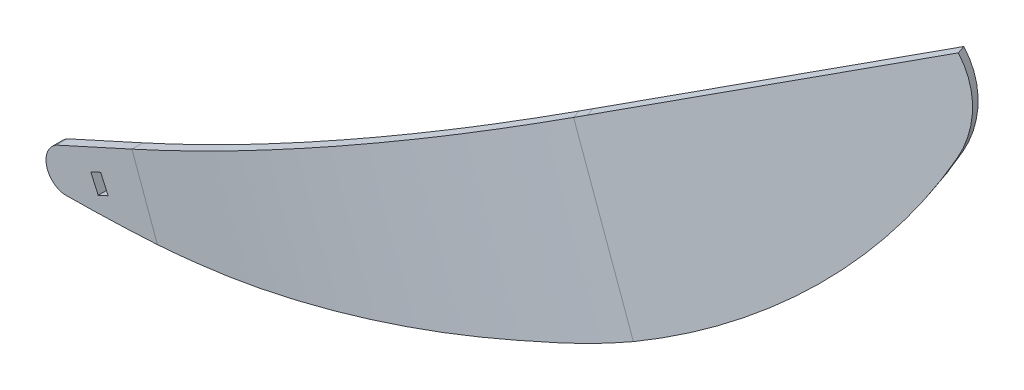
ISO-10303-21;
HEADER;
FILE_DESCRIPTION(('STEP AP214'),'2;1');
FILE_NAME('part.step','',(''),(''),'','','');
FILE_SCHEMA(('AUTOMOTIVE_DESIGN { 1 0 10303 214 1 1 1 1 }'));
ENDSEC;
DATA;
#1=APPLICATION_CONTEXT('core data for automotive mechanical design processes');
#2=APPLICATION_PROTOCOL_DEFINITION('international standard','automotive_design',2000,#1);
#3=PRODUCT_CONTEXT('',#1,'mechanical');
#4=PRODUCT('Part','Part','',(#3));
#5=PRODUCT_RELATED_PRODUCT_CATEGORY('part','',(#4));
#6=PRODUCT_DEFINITION_FORMATION('','',#4);
#7=PRODUCT_DEFINITION_CONTEXT('part definition',#1,'design');
#8=PRODUCT_DEFINITION('design','',#6,#7);
#9=PRODUCT_DEFINITION_SHAPE('','',#8);
#10=(LENGTH_UNIT() NAMED_UNIT(*) SI_UNIT(.MILLI.,.METRE.));
#11=(NAMED_UNIT(*) PLANE_ANGLE_UNIT() SI_UNIT($,.RADIAN.));
#12=(NAMED_UNIT(*) SI_UNIT($,.STERADIAN.) SOLID_ANGLE_UNIT());
#13=UNCERTAINTY_MEASURE_WITH_UNIT(LENGTH_MEASURE(1.E-05),#10,'distance_accuracy_value','');
#14=(GEOMETRIC_REPRESENTATION_CONTEXT(3) GLOBAL_UNCERTAINTY_ASSIGNED_CONTEXT((#13)) GLOBAL_UNIT_ASSIGNED_CONTEXT((#10,
#11,#12)) REPRESENTATION_CONTEXT('',''));
#15=CARTESIAN_POINT('',(0.,0.,0.));
#16=DIRECTION('',(0.,0.,1.));
#17=DIRECTION('',(1.,0.,0.));
#18=AXIS2_PLACEMENT_3D('',#15,#16,#17);
#19=CARTESIAN_POINT('',(83.014106092908,142.239745588982,-13.0819028788313));
#20=DIRECTION('',(0.397093410751114,0.144647911477414,0.906307787036649));
#21=DIRECTION('',(0.917283463911632,-0.0301308807093948,-0.397093410751114));
#22=AXIS2_PLACEMENT_3D('',#19,#20,#21);
#23=CYLINDRICAL_SURFACE('',#22,58.3606331759639);
#24=CARTESIAN_POINT('',(83.6192764508927,142.460189006073,-11.7006898113874));
#25=DIRECTION('',(0.397093410751114,0.144647911477414,0.90630778703665));
#26=DIRECTION('',(0.917283463911632,-0.0301308807093948,-0.397093410751114));
#27=AXIS2_PLACEMENT_3D('',#24,#25,#26);
#28=CIRCLE('',#27,58.3606331759639);
#29=CARTESIAN_POINT('',(104.279360920723,87.8798983524995,-12.0416979789016));
#30=VERTEX_POINT('',#29);
#31=CARTESIAN_POINT('',(132.600445425095,115.799936331135,-28.9064887736133));
#32=VERTEX_POINT('',#31);
#33=EDGE_CURVE('E375',#30,#32,#28,.T.);
#34=ORIENTED_EDGE('',*,*,#33,.F.);
#35=CARTESIAN_POINT('',(103.674190562738,87.6594549354079,-13.4229110463455));
#36=CARTESIAN_POINT('',(104.279360920723,87.8798983524994,-12.0416979789016));
#37=B_SPLINE_CURVE_WITH_KNOTS('',1,(#35,#36),.UNSPECIFIED.,.F.,.F.,(2,2),(0.,1.),.UNSPECIFIED.);
#38=CARTESIAN_POINT('',(103.674190562738,87.6594549354078,-13.4229110463455));
#39=VERTEX_POINT('',#38);
#40=EDGE_CURVE('E324',#30,#39,#37,.F.);
#41=ORIENTED_EDGE('',*,*,#40,.T.);
#42=CARTESIAN_POINT('',(83.014106092908,142.239745588982,-13.0819028788313));
#43=DIRECTION('',(0.397093410751114,0.144647911477414,0.90630778703665));
#44=DIRECTION('',(0.917283463911632,-0.0301308807093948,-0.397093410751114));
#45=AXIS2_PLACEMENT_3D('',#42,#43,#44);
#46=CIRCLE('',#45,58.3606331759639);
#47=CARTESIAN_POINT('',(131.99527506711,115.579492914043,-30.2877018410572));
#48=VERTEX_POINT('',#47);
#49=EDGE_CURVE('E444',#39,#48,#46,.T.);
#50=ORIENTED_EDGE('',*,*,#49,.T.);
#51=DIRECTION('',(0.397093410751114,0.144647911477414,0.906307787036649));
#52=VECTOR('',#51,1.);
#53=CARTESIAN_POINT('',(131.99527506711,115.579492914043,-30.2877018410572));
#54=LINE('',#53,#52);
#55=EDGE_CURVE('E460',#48,#32,#54,.T.);
#56=ORIENTED_EDGE('',*,*,#55,.T.);
#57=EDGE_LOOP('',(#34,#41,#50,#56));
#58=FACE_BOUND('',#57,.T.);
#59=ADVANCED_FACE('F58',(#58),#23,.T.);
#60=CARTESIAN_POINT('',(96.5992940794356,111.170574986929,-14.0754924818592));
#61=DIRECTION('',(-0.40636219666363,0.913140755774543,0.0323067371643325));
#62=DIRECTION('',(-0.822913475561529,-0.381118015644391,0.421381620257132));
#63=AXIS2_PLACEMENT_3D('',#60,#61,#62);
#64=PLANE('',#63);
#65=DIRECTION('',(-0.822913475561529,-0.381118015644391,0.421381620257132));
#66=VECTOR('',#65,1.);
#67=CARTESIAN_POINT('',(96.5992940794356,111.170574986929,-14.0754924818592));
#68=LINE('',#67,#66);
#69=CARTESIAN_POINT('',(96.5992940794356,111.170574986929,-14.0754924818592));
#70=VERTEX_POINT('',#69);
#71=CARTESIAN_POINT('',(95.3248719609345,110.580348622529,-13.4229110463455));
#72=VERTEX_POINT('',#71);
#73=EDGE_CURVE('E447',#70,#72,#68,.T.);
#74=ORIENTED_EDGE('',*,*,#73,.T.);
#75=CARTESIAN_POINT('',(95.9300423189192,110.80079203962,-12.0416979789016));
#76=CARTESIAN_POINT('',(95.3248719609345,110.580348622529,-13.4229110463455));
#77=B_SPLINE_CURVE_WITH_KNOTS('',1,(#75,#76),.UNSPECIFIED.,.F.,.F.,(2,2),(0.,1.),.UNSPECIFIED.);
#78=CARTESIAN_POINT('',(95.9300423189192,110.800792039621,-12.0416979789017));
#79=VERTEX_POINT('',#78);
#80=EDGE_CURVE('E12',#72,#79,#77,.F.);
#81=ORIENTED_EDGE('',*,*,#80,.T.);
#82=DIRECTION('',(-0.822913475561529,-0.381118015644391,0.421381620257132));
#83=VECTOR('',#82,1.);
#84=CARTESIAN_POINT('',(97.2044644374203,111.391018404021,-12.6942794144154));
#85=LINE('',#84,#83);
#86=CARTESIAN_POINT('',(97.2044644374203,111.391018404021,-12.6942794144154));
#87=VERTEX_POINT('',#86);
#88=EDGE_CURVE('E454',#87,#79,#85,.T.);
#89=ORIENTED_EDGE('',*,*,#88,.F.);
#90=DIRECTION('',(0.397093410751114,0.144647911477414,0.906307787036649));
#91=VECTOR('',#90,1.);
#92=CARTESIAN_POINT('',(96.5992940794356,111.170574986929,-14.0754924818592));
#93=LINE('',#92,#91);
#94=EDGE_CURVE('E455',#70,#87,#93,.T.);
#95=ORIENTED_EDGE('',*,*,#94,.F.);
#96=EDGE_LOOP('',(#74,#81,#89,#95));
#97=FACE_BOUND('',#96,.T.);
#98=ADVANCED_FACE('F60',(#97),#64,.T.);
#99=CARTESIAN_POINT('',(32.7005911916889,324.934882128188,-18.5141685714529));
#100=DIRECTION('',(0.397093410751114,0.144647911477414,0.90630778703665));
#101=DIRECTION('',(0.917283463911632,-0.0301308807093948,-0.397093410751114));
#102=AXIS2_PLACEMENT_3D('',#99,#100,#101);
#103=PLANE('',#102);
#104=ORIENTED_EDGE('',*,*,#88,.T.);
#105=DIRECTION('',(0.342266117137559,-0.93960305717871,0.));
#106=VECTOR('',#105,1.);
#107=CARTESIAN_POINT('',(19.6586583606416,320.184140125012,-12.0416979789016));
#108=LINE('',#107,#106);
#109=EDGE_CURVE('E70',#79,#30,#108,.T.);
#110=ORIENTED_EDGE('',*,*,#109,.T.);
#111=ORIENTED_EDGE('',*,*,#33,.T.);
#112=CARTESIAN_POINT('',(122.932266417406,121.062287162069,-25.5103112666063));
#113=DIRECTION('',(0.397093410751114,0.144647911477414,0.90630778703665));
#114=DIRECTION('',(0.917283463911632,-0.0301308807093948,-0.397093410751114));
#115=AXIS2_PLACEMENT_3D('',#112,#113,#114);
#116=CIRCLE('',#115,11.5195504795819);
#117=CARTESIAN_POINT('',(131.427037788079,127.255165100489,-30.2206366748398));
#118=VERTEX_POINT('',#117);
#119=EDGE_CURVE('E448',#32,#118,#116,.T.);
#120=ORIENTED_EDGE('',*,*,#119,.T.);
#121=DIRECTION('',(-0.822784282779922,-0.381408213456814,0.421371331153426));
#122=VECTOR('',#121,1.);
#123=CARTESIAN_POINT('',(131.427037788079,127.255165100489,-30.2206366748398));
#124=LINE('',#123,#122);
#125=EDGE_CURVE('E451',#118,#87,#124,.T.);
#126=ORIENTED_EDGE('',*,*,#125,.T.);
#127=EDGE_LOOP('',(#104,#110,#111,#120,#126));
#128=FACE_BOUND('',#127,.T.);
#129=ADVANCED_FACE('F579',(#128),#103,.T.);
#130=CARTESIAN_POINT('',(130.821867430095,127.034721683398,-31.6018497422836));
#131=DIRECTION('',(-0.406623716903448,0.91301958161526,0.0324406602694974));
#132=DIRECTION('',(-0.822784282779922,-0.381408213456814,0.421371331153426));
#133=AXIS2_PLACEMENT_3D('',#130,#131,#132);
#134=PLANE('',#133);
#135=ORIENTED_EDGE('',*,*,#125,.F.);
#136=DIRECTION('',(0.397093410751114,0.144647911477414,0.906307787036649));
#137=VECTOR('',#136,1.);
#138=CARTESIAN_POINT('',(130.821867430095,127.034721683398,-31.6018497422836));
#139=LINE('',#138,#137);
#140=CARTESIAN_POINT('',(130.821867430095,127.034721683398,-31.6018497422836));
#141=VERTEX_POINT('',#140);
#142=EDGE_CURVE('E458',#141,#118,#139,.T.);
#143=ORIENTED_EDGE('',*,*,#142,.F.);
#144=DIRECTION('',(-0.822784282779922,-0.381408213456814,0.421371331153426));
#145=VECTOR('',#144,1.);
#146=CARTESIAN_POINT('',(130.821867430095,127.034721683398,-31.6018497422836));
#147=LINE('',#146,#145);
#148=EDGE_CURVE('E443',#141,#70,#147,.T.);
#149=ORIENTED_EDGE('',*,*,#148,.T.);
#150=ORIENTED_EDGE('',*,*,#94,.T.);
#151=EDGE_LOOP('',(#135,#143,#149,#150));
#152=FACE_BOUND('',#151,.T.);
#153=ADVANCED_FACE('F424',(#152),#134,.T.);
#154=CARTESIAN_POINT('',(122.327096059422,120.841843744977,-26.8915243340501));
#155=DIRECTION('',(0.397093410751114,0.144647911477414,0.906307787036649));
#156=DIRECTION('',(0.917283463911632,-0.0301308807093948,-0.397093410751114));
#157=AXIS2_PLACEMENT_3D('',#154,#155,#156);
#158=CYLINDRICAL_SURFACE('',#157,11.5195504795819);
#159=ORIENTED_EDGE('',*,*,#119,.F.);
#160=ORIENTED_EDGE('',*,*,#55,.F.);
#161=CARTESIAN_POINT('',(122.327096059422,120.841843744977,-26.8915243340501));
#162=DIRECTION('',(0.397093410751114,0.144647911477414,0.90630778703665));
#163=DIRECTION('',(0.917283463911632,-0.0301308807093948,-0.397093410751114));
#164=AXIS2_PLACEMENT_3D('',#161,#162,#163);
#165=CIRCLE('',#164,11.5195504795819);
#166=EDGE_CURVE('E440',#48,#141,#165,.T.);
#167=ORIENTED_EDGE('',*,*,#166,.T.);
#168=ORIENTED_EDGE('',*,*,#142,.T.);
#169=EDGE_LOOP('',(#159,#160,#167,#168));
#170=FACE_BOUND('',#169,.T.);
#171=ADVANCED_FACE('F573',(#170),#158,.T.);
#172=CARTESIAN_POINT('',(32.0954208337042,324.714438711096,-19.8953816388968));
#173=DIRECTION('',(0.397093410751114,0.144647911477414,0.90630778703665));
#174=DIRECTION('',(0.917283463911632,-0.0301308807093948,-0.397093410751114));
#175=AXIS2_PLACEMENT_3D('',#172,#173,#174);
#176=PLANE('',#175);
#177=DIRECTION('',(0.342266117137559,-0.93960305717871,0.));
#178=VECTOR('',#177,1.);
#179=CARTESIAN_POINT('',(19.0534880026569,319.96369670792,-13.4229110463455));
#180=LINE('',#179,#178);
#181=EDGE_CURVE('E457',#72,#39,#180,.T.);
#182=ORIENTED_EDGE('',*,*,#181,.F.);
#183=ORIENTED_EDGE('',*,*,#73,.F.);
#184=ORIENTED_EDGE('',*,*,#148,.F.);
#185=ORIENTED_EDGE('',*,*,#166,.F.);
#186=ORIENTED_EDGE('',*,*,#49,.F.);
#187=EDGE_LOOP('',(#182,#183,#184,#185,#186));
#188=FACE_BOUND('',#187,.T.);
#189=ADVANCED_FACE('F498',(#188),#176,.F.);
#190=CARTESIAN_POINT('',(37.2781516197468,80.901977041363,-1.524));
#191=DIRECTION('',(0.,0.,1.));
#192=DIRECTION('',(1.,0.,0.));
#193=AXIS2_PLACEMENT_3D('',#190,#191,#192);
#194=CYLINDRICAL_SURFACE('',#193,2.91276832147742);
#195=CARTESIAN_POINT('',(37.2781516197468,80.901977041363,0.));
#196=DIRECTION('',(0.,0.,1.));
#197=DIRECTION('',(-1.,0.,0.));
#198=AXIS2_PLACEMENT_3D('',#195,#196,#197);
#199=CIRCLE('',#198,2.91276832147742);
#200=CARTESIAN_POINT('',(35.7950190023547,83.4088749120052,0.));
#201=VERTEX_POINT('',#200);
#202=CARTESIAN_POINT('',(36.9222362440405,78.0110354058507,0.));
#203=VERTEX_POINT('',#202);
#204=EDGE_CURVE('E377',#201,#203,#199,.T.);
#205=ORIENTED_EDGE('',*,*,#204,.F.);
#206=DIRECTION('',(0.,0.,1.));
#207=VECTOR('',#206,1.);
#208=CARTESIAN_POINT('',(35.7950190023547,83.4088749120052,-1.524));
#209=LINE('',#208,#207);
#210=CARTESIAN_POINT('',(35.7950190023547,83.4088749120052,-1.524));
#211=VERTEX_POINT('',#210);
#212=EDGE_CURVE('E367',#211,#201,#209,.T.);
#213=ORIENTED_EDGE('',*,*,#212,.F.);
#214=CARTESIAN_POINT('',(37.2781516197468,80.901977041363,-1.524));
#215=DIRECTION('',(0.,0.,1.));
#216=DIRECTION('',(-1.,0.,0.));
#217=AXIS2_PLACEMENT_3D('',#214,#215,#216);
#218=CIRCLE('',#217,2.91276832147742);
#219=CARTESIAN_POINT('',(36.9222362440405,78.0110354058507,-1.524));
#220=VERTEX_POINT('',#219);
#221=EDGE_CURVE('E385',#211,#220,#218,.T.);
#222=ORIENTED_EDGE('',*,*,#221,.T.);
#223=DIRECTION('',(0.,0.,1.));
#224=VECTOR('',#223,1.);
#225=CARTESIAN_POINT('',(36.9222362440405,78.0110354058507,-1.524));
#226=LINE('',#225,#224);
#227=EDGE_CURVE('E382',#220,#203,#226,.T.);
#228=ORIENTED_EDGE('',*,*,#227,.T.);
#229=EDGE_LOOP('',(#205,#213,#222,#228));
#230=FACE_BOUND('',#229,.T.);
#231=ADVANCED_FACE('F567',(#230),#194,.T.);
#232=CARTESIAN_POINT('',(35.3300841042553,325.892718868233,-1.524));
#233=DIRECTION('',(0.,0.,1.));
#234=DIRECTION('',(1.,0.,0.));
#235=AXIS2_PLACEMENT_3D('',#232,#233,#234);
#236=PLANE('',#235);
#237=DIRECTION('',(-0.413091850992311,0.910689366712792,0.));
#238=VECTOR('',#237,1.);
#239=CARTESIAN_POINT('',(41.9946653098515,83.2168798130125,-1.524));
#240=LINE('',#239,#238);
#241=CARTESIAN_POINT('',(43.0439186113719,80.903728821562,-1.524));
#242=VERTEX_POINT('',#241);
#243=CARTESIAN_POINT('',(41.9946653098515,83.2168798130125,-1.524));
#244=VERTEX_POINT('',#243);
#245=EDGE_CURVE('E171',#242,#244,#240,.T.);
#246=ORIENTED_EDGE('',*,*,#245,.T.);
#247=DIRECTION('',(-0.910689366712794,-0.413091850992307,0.));
#248=VECTOR('',#247,1.);
#249=CARTESIAN_POINT('',(40.6067747149812,82.5873278321002,-1.524));
#250=LINE('',#249,#248);
#251=CARTESIAN_POINT('',(40.6067747149812,82.5873278321002,-1.524));
#252=VERTEX_POINT('',#251);
#253=EDGE_CURVE('E165',#244,#252,#250,.T.);
#254=ORIENTED_EDGE('',*,*,#253,.T.);
#255=DIRECTION('',(0.413091850992311,-0.910689366712792,0.));
#256=VECTOR('',#255,1.);
#257=CARTESIAN_POINT('',(40.6067747149812,82.5873278321002,-1.524));
#258=LINE('',#257,#256);
#259=CARTESIAN_POINT('',(41.6560280165017,80.2741768406497,-1.524));
#260=VERTEX_POINT('',#259);
#261=EDGE_CURVE('E174',#252,#260,#258,.T.);
#262=ORIENTED_EDGE('',*,*,#261,.T.);
#263=DIRECTION('',(0.910689366712794,0.413091850992307,0.));
#264=VECTOR('',#263,1.);
#265=CARTESIAN_POINT('',(41.6560280165016,80.2741768406497,-1.524));
#266=LINE('',#265,#264);
#267=EDGE_CURVE('E77',#260,#242,#266,.T.);
#268=ORIENTED_EDGE('',*,*,#267,.T.);
#269=EDGE_LOOP('',(#246,#254,#262,#268));
#270=FACE_BOUND('',#269,.T.);
#271=DIRECTION('',(-0.910689366712793,-0.413091850992309,0.));
#272=VECTOR('',#271,1.);
#273=CARTESIAN_POINT('',(98.6216454393514,111.907250269281,-1.524));
#274=LINE('',#273,#272);
#275=CARTESIAN_POINT('',(46.3551161989758,88.1989715762025,-1.524));
#276=VERTEX_POINT('',#275);
#277=EDGE_CURVE('E376',#276,#211,#274,.T.);
#278=ORIENTED_EDGE('',*,*,#277,.F.);
#279=DIRECTION('',(0.342266117137559,-0.93960305717871,0.));
#280=VECTOR('',#279,1.);
#281=CARTESIAN_POINT('',(-31.3773751627346,301.593411950288,-1.524));
#282=LINE('',#281,#280);
#283=CARTESIAN_POINT('',(49.9117445695242,78.4351687254731,-1.52399999999997));
#284=VERTEX_POINT('',#283);
#285=EDGE_CURVE('E384',#276,#284,#282,.T.);
#286=ORIENTED_EDGE('',*,*,#285,.T.);
#287=CARTESIAN_POINT('',(35.3300841042553,325.892718868233,-1.524));
#288=DIRECTION('',(0.,0.,1.));
#289=DIRECTION('',(1.,0.,0.));
#290=AXIS2_PLACEMENT_3D('',#287,#288,#289);
#291=CIRCLE('',#290,247.886796632215);
#292=EDGE_CURVE('E388',#220,#284,#291,.T.);
#293=ORIENTED_EDGE('',*,*,#292,.F.);
#294=ORIENTED_EDGE('',*,*,#221,.F.);
#295=EDGE_LOOP('',(#278,#286,#293,#294));
#296=FACE_BOUND('',#295,.T.);
#297=ADVANCED_FACE('F178',(#270,#296),#236,.F.);
#298=CARTESIAN_POINT('',(35.3300841042553,325.892718868233,-1.524));
#299=DIRECTION('',(0.,0.,1.));
#300=DIRECTION('',(1.,0.,0.));
#301=AXIS2_PLACEMENT_3D('',#298,#299,#300);
#302=CYLINDRICAL_SURFACE('',#301,247.886796632215);
#303=CARTESIAN_POINT('',(49.9117445695242,78.4351687254731,0.));
#304=CARTESIAN_POINT('',(49.9117445695242,78.4351687254731,-1.52399999999997));
#305=B_SPLINE_CURVE_WITH_KNOTS('',1,(#303,#304),.UNSPECIFIED.,.F.,.F.,(2,2),(0.,1.),.UNSPECIFIED.);
#306=CARTESIAN_POINT('',(49.9117445695242,78.4351687254731,0.));
#307=VERTEX_POINT('',#306);
#308=EDGE_CURVE('E363',#307,#284,#305,.T.);
#309=ORIENTED_EDGE('',*,*,#308,.F.);
#310=CARTESIAN_POINT('',(35.3300841042553,325.892718868233,0.));
#311=DIRECTION('',(0.,0.,1.));
#312=DIRECTION('',(1.,0.,0.));
#313=AXIS2_PLACEMENT_3D('',#310,#311,#312);
#314=CIRCLE('',#313,247.886796632215);
#315=EDGE_CURVE('E380',#203,#307,#314,.T.);
#316=ORIENTED_EDGE('',*,*,#315,.F.);
#317=ORIENTED_EDGE('',*,*,#227,.F.);
#318=ORIENTED_EDGE('',*,*,#292,.T.);
#319=EDGE_LOOP('',(#309,#316,#317,#318));
#320=FACE_BOUND('',#319,.T.);
#321=ADVANCED_FACE('F405',(#320),#302,.T.);
#322=CARTESIAN_POINT('',(35.3300841042553,325.892718868233,0.));
#323=DIRECTION('',(0.,0.,1.));
#324=DIRECTION('',(1.,0.,0.));
#325=AXIS2_PLACEMENT_3D('',#322,#323,#324);
#326=PLANE('',#325);
#327=DIRECTION('',(-0.910689366712794,-0.413091850992307,0.));
#328=VECTOR('',#327,1.);
#329=CARTESIAN_POINT('',(40.6067747149812,82.5873278321002,0.));
#330=LINE('',#329,#328);
#331=CARTESIAN_POINT('',(41.9946653098515,83.2168798130125,0.));
#332=VERTEX_POINT('',#331);
#333=CARTESIAN_POINT('',(40.6067747149812,82.5873278321002,0.));
#334=VERTEX_POINT('',#333);
#335=EDGE_CURVE('E85',#332,#334,#330,.T.);
#336=ORIENTED_EDGE('',*,*,#335,.F.);
#337=DIRECTION('',(-0.413091850992311,0.910689366712792,0.));
#338=VECTOR('',#337,1.);
#339=CARTESIAN_POINT('',(41.9946653098515,83.2168798130125,0.));
#340=LINE('',#339,#338);
#341=CARTESIAN_POINT('',(43.0439186113719,80.903728821562,0.));
#342=VERTEX_POINT('',#341);
#343=EDGE_CURVE('E181',#342,#332,#340,.T.);
#344=ORIENTED_EDGE('',*,*,#343,.F.);
#345=DIRECTION('',(0.910689366712794,0.413091850992307,0.));
#346=VECTOR('',#345,1.);
#347=CARTESIAN_POINT('',(41.6560280165016,80.2741768406497,0.));
#348=LINE('',#347,#346);
#349=CARTESIAN_POINT('',(41.6560280165016,80.2741768406497,0.));
#350=VERTEX_POINT('',#349);
#351=EDGE_CURVE('E184',#350,#342,#348,.T.);
#352=ORIENTED_EDGE('',*,*,#351,.F.);
#353=DIRECTION('',(0.413091850992311,-0.910689366712792,0.));
#354=VECTOR('',#353,1.);
#355=CARTESIAN_POINT('',(40.6067747149812,82.5873278321002,0.));
#356=LINE('',#355,#354);
#357=EDGE_CURVE('E190',#334,#350,#356,.T.);
#358=ORIENTED_EDGE('',*,*,#357,.F.);
#359=EDGE_LOOP('',(#336,#344,#352,#358));
#360=FACE_BOUND('',#359,.T.);
#361=DIRECTION('',(0.342266117137559,-0.93960305717871,0.));
#362=VECTOR('',#361,1.);
#363=CARTESIAN_POINT('',(-31.3773751627346,301.593411950288,0.));
#364=LINE('',#363,#362);
#365=CARTESIAN_POINT('',(46.3551161989758,88.1989715762025,0.));
#366=VERTEX_POINT('',#365);
#367=EDGE_CURVE('E403',#366,#307,#364,.T.);
#368=ORIENTED_EDGE('',*,*,#367,.F.);
#369=DIRECTION('',(-0.910689366712793,-0.413091850992309,0.));
#370=VECTOR('',#369,1.);
#371=CARTESIAN_POINT('',(98.6216454393514,111.907250269281,0.));
#372=LINE('',#371,#370);
#373=EDGE_CURVE('E381',#366,#201,#372,.T.);
#374=ORIENTED_EDGE('',*,*,#373,.T.);
#375=ORIENTED_EDGE('',*,*,#204,.T.);
#376=ORIENTED_EDGE('',*,*,#315,.T.);
#377=EDGE_LOOP('',(#368,#374,#375,#376));
#378=FACE_BOUND('',#377,.T.);
#379=ADVANCED_FACE('F415',(#360,#378),#326,.T.);
#380=CARTESIAN_POINT('',(98.6216454393514,111.907250269281,-1.524));
#381=DIRECTION('',(-0.413091850992309,0.910689366712793,0.));
#382=DIRECTION('',(-0.910689366712793,-0.413091850992309,0.));
#383=AXIS2_PLACEMENT_3D('',#380,#381,#382);
#384=PLANE('',#383);
#385=CARTESIAN_POINT('',(46.3551161989758,88.1989715762025,-1.52399999999997));
#386=CARTESIAN_POINT('',(46.3551161989758,88.1989715762025,0.));
#387=B_SPLINE_CURVE_WITH_KNOTS('',1,(#385,#386),.UNSPECIFIED.,.F.,.F.,(2,2),(0.,1.),.UNSPECIFIED.);
#388=EDGE_CURVE('E350',#276,#366,#387,.T.);
#389=ORIENTED_EDGE('',*,*,#388,.F.);
#390=ORIENTED_EDGE('',*,*,#277,.T.);
#391=ORIENTED_EDGE('',*,*,#212,.T.);
#392=ORIENTED_EDGE('',*,*,#373,.F.);
#393=EDGE_LOOP('',(#389,#390,#391,#392));
#394=FACE_BOUND('',#393,.T.);
#395=ADVANCED_FACE('F418',(#394),#384,.T.);
#396=CARTESIAN_POINT('',(46.3551161989758,88.1989715762025,0.));
#397=CARTESIAN_POINT('',(54.8937722532483,92.0665536068937,0.));
#398=CARTESIAN_POINT('',(63.4318040711659,95.9338822291465,-1.02357284543216));
#399=CARTESIAN_POINT('',(80.0924845532157,103.517255237512,-5.06949111640319));
#400=CARTESIAN_POINT('',(88.2142079691066,107.232936566575,-8.09161625987283));
#401=CARTESIAN_POINT('',(95.9300423189192,110.80079203962,-12.0416979789016));
#402=CARTESIAN_POINT('',(46.3551161989758,88.1989715762025,-1.52399999999997));
#403=CARTESIAN_POINT('',(54.7896357334243,92.0286201373076,-1.52399999999997));
#404=CARTESIAN_POINT('',(63.2235385730631,95.858018040727,-2.53543561801597));
#405=CARTESIAN_POINT('',(79.6808864509644,103.367323749739,-6.53337857352094));
#406=CARTESIAN_POINT('',(87.7034173498989,107.046872548509,-9.5196682503081));
#407=CARTESIAN_POINT('',(95.3248719609345,110.580348622529,-13.4229110463455));
#408=B_SPLINE_SURFACE_WITH_KNOTS('',1,3,((#396,#397,#398,#399,#400,#401),(#402,#403,#404,#405,
#406,#407)),.UNSPECIFIED.,.F.,.F.,.F.,(2,2),(4,2,4),(0.,1.),(0.,0.5,1.),.UNSPECIFIED.);
#409=CARTESIAN_POINT('',(46.3551161989758,88.1989715762025,0.));
#410=CARTESIAN_POINT('',(54.8937722532483,92.0665536068937,0.));
#411=CARTESIAN_POINT('',(63.4318040711659,95.9338822291465,-1.02357284543216));
#412=CARTESIAN_POINT('',(80.0924845532157,103.517255237512,-5.06949111640319));
#413=CARTESIAN_POINT('',(88.2142079691066,107.232936566575,-8.09161625987283));
#414=CARTESIAN_POINT('',(95.9300423189192,110.80079203962,-12.0416979789016));
#415=B_SPLINE_CURVE_WITH_KNOTS('',3,(#409,#410,#411,#412,#413,#414),.UNSPECIFIED.,.F.,.F.,(4,2,
4),(0.,0.5,1.),.UNSPECIFIED.);
#416=EDGE_CURVE('E196',#366,#79,#415,.T.);
#417=CARTESIAN_POINT('',(95.3248719609345,110.580348622529,-13.4229110463455));
#418=CARTESIAN_POINT('',(87.7034173498989,107.046872548509,-9.5196682503081));
#419=CARTESIAN_POINT('',(79.6808864509644,103.367323749739,-6.53337857352094));
#420=CARTESIAN_POINT('',(63.2235385730631,95.858018040727,-2.53543561801597));
#421=CARTESIAN_POINT('',(54.7896357334243,92.0286201373076,-1.52399999999997));
#422=CARTESIAN_POINT('',(46.3551161989758,88.1989715762025,-1.52399999999997));
#423=B_SPLINE_CURVE_WITH_KNOTS('',3,(#417,#418,#419,#420,#421,#422),.UNSPECIFIED.,.F.,.F.,(4,2,
4),(0.,0.5,1.),.UNSPECIFIED.);
#424=EDGE_CURVE('E502',#276,#72,#423,.F.);
#425=ORIENTED_EDGE('',*,*,#388,.T.);
#426=ORIENTED_EDGE('',*,*,#416,.T.);
#427=ORIENTED_EDGE('',*,*,#80,.F.);
#428=ORIENTED_EDGE('',*,*,#424,.F.);
#429=EDGE_LOOP('',(#425,#426,#427,#428));
#430=FACE_BOUND('',#429,.T.);
#431=ADVANCED_FACE('F282',(#430),#408,.F.);
#432=CARTESIAN_POINT('',(104.279360920723,87.8798983524994,-12.0416979789016));
#433=CARTESIAN_POINT('',(102.029669619416,87.0635004781184,-10.9257108342432));
#434=CARTESIAN_POINT('',(99.5720209472463,86.3372960787906,-9.82257774276949));
#435=CARTESIAN_POINT('',(96.9012234431022,85.6994125576863,-8.76032570054251));
#436=CARTESIAN_POINT('',(103.674190562738,87.6594549354079,-13.4229110463455));
#437=CARTESIAN_POINT('',(101.451163681757,86.8527700217424,-12.3201569614334));
#438=CARTESIAN_POINT('',(99.0220124426963,86.1369462926248,-11.230104476703));
#439=CARTESIAN_POINT('',(96.3816070289747,85.5101335945054,-10.1804483206942));
#440=B_SPLINE_SURFACE_WITH_KNOTS('',1,3,((#432,#433,#434,#435),(#436,#437,#438,#439)),
.UNSPECIFIED.,.F.,.F.,.F.,(2,2),(4,4),(0.,1.),(0.,1.),.UNSPECIFIED.);
#441=CARTESIAN_POINT('',(104.279360920723,87.8798983524994,-12.0416979789016));
#442=CARTESIAN_POINT('',(102.029669619416,87.0635004781184,-10.9257108342432));
#443=CARTESIAN_POINT('',(99.5720209472463,86.3372960787906,-9.82257774276949));
#444=CARTESIAN_POINT('',(96.9012234431022,85.6994125576863,-8.76032570054251));
#445=B_SPLINE_CURVE_WITH_KNOTS('',3,(#441,#442,#443,#444),.UNSPECIFIED.,.F.,.F.,(4,4),(0.,1.),.UNSPECIFIED.);
#446=CARTESIAN_POINT('',(96.9012234431022,85.6994125576863,-8.76032570054251));
#447=VERTEX_POINT('',#446);
#448=EDGE_CURVE('E255',#30,#447,#445,.T.);
#449=CARTESIAN_POINT('',(96.9012234431022,85.6994125576863,-8.76032570054251));
#450=CARTESIAN_POINT('',(96.3816070289747,85.5101335945054,-10.1804483206942));
#451=B_SPLINE_CURVE_WITH_KNOTS('',1,(#449,#450),.UNSPECIFIED.,.F.,.F.,(2,2),(0.,1.),.UNSPECIFIED.);
#452=CARTESIAN_POINT('',(96.3816070289747,85.5101335945054,-10.1804483206942));
#453=VERTEX_POINT('',#452);
#454=EDGE_CURVE('E315',#447,#453,#451,.T.);
#455=CARTESIAN_POINT('',(96.3816070289747,85.5101335945054,-10.1804483206942));
#456=CARTESIAN_POINT('',(99.0220124426963,86.1369462926248,-11.230104476703));
#457=CARTESIAN_POINT('',(101.451163681757,86.8527700217424,-12.3201569614334));
#458=CARTESIAN_POINT('',(103.674190562738,87.6594549354079,-13.4229110463455));
#459=B_SPLINE_CURVE_WITH_KNOTS('',3,(#455,#456,#457,#458),.UNSPECIFIED.,.F.,.F.,(4,4),(0.,1.),.UNSPECIFIED.);
#460=EDGE_CURVE('E245',#39,#453,#459,.F.);
#461=ORIENTED_EDGE('',*,*,#40,.F.);
#462=ORIENTED_EDGE('',*,*,#448,.T.);
#463=ORIENTED_EDGE('',*,*,#454,.T.);
#464=ORIENTED_EDGE('',*,*,#460,.F.);
#465=EDGE_LOOP('',(#461,#462,#463,#464));
#466=FACE_BOUND('',#465,.T.);
#467=ADVANCED_FACE('F271',(#466),#440,.F.);
#468=CARTESIAN_POINT('',(96.9012234431022,85.6994125576863,-8.76032570054249));
#469=CARTESIAN_POINT('',(94.548673446871,85.1311282349025,-7.82379540264205));
#470=CARTESIAN_POINT('',(92.4236552640698,84.6290288775423,-7.06176165566579));
#471=CARTESIAN_POINT('',(89.602894444786,83.9845065815051,-6.11762527108106));
#472=CARTESIAN_POINT('',(88.7236756020016,83.7877324104199,-5.83621346966934));
#473=CARTESIAN_POINT('',(87.4986750982567,83.5204999759663,-5.45751298023844));
#474=CARTESIAN_POINT('',(87.1059735388889,83.436075109284,-5.33852505595712));
#475=CARTESIAN_POINT('',(86.5406034176089,83.3165020759583,-5.17018094025863));
#476=CARTESIAN_POINT('',(86.3560934201418,83.2778216569714,-5.11575647048583));
#477=CARTESIAN_POINT('',(86.0852749514906,83.2215765563035,-5.03656930462011));
#478=CARTESIAN_POINT('',(85.9959931975328,83.2031241037956,-5.01058187763457));
#479=CARTESIAN_POINT('',(85.8635603103081,83.175890440521,-4.97220280066571));
#480=CARTESIAN_POINT('',(85.8196643040399,83.1668867215936,-4.95951012135041));
#481=CARTESIAN_POINT('',(85.7541931111862,83.1534925357215,-4.94062034636497));
#482=CARTESIAN_POINT('',(85.7324315162561,83.1490463724918,-4.934348628853));
#483=CARTESIAN_POINT('',(85.6998823750554,83.1424049929184,-4.92497820573763));
#484=CARTESIAN_POINT('',(85.6890482031832,83.1401958439375,-4.92186092356744));
#485=CARTESIAN_POINT('',(85.6728202640234,83.136889088915,-4.91719426894119));
#486=CARTESIAN_POINT('',(85.6674148374113,83.1357879986488,-4.91564026217121));
#487=CARTESIAN_POINT('',(85.6593125278844,83.1341381056273,-4.91331156672056));
#488=CARTESIAN_POINT('',(85.6566127297739,83.1335884316831,-4.91253572068777));
#489=CARTESIAN_POINT('',(85.6512150771381,83.1324896646315,-4.91098479978185));
#490=CARTESIAN_POINT('',(85.6494434493205,83.1321290542092,-4.91047578694771));
#491=CARTESIAN_POINT('',(83.7907883375012,82.7539016686571,-4.37657024877585));
#492=CARTESIAN_POINT('',(81.8898357923739,82.3911006211966,-3.87883417738187));
#493=CARTESIAN_POINT('',(78.9710590116565,81.8694909957128,-3.19113360256133));
#494=CARTESIAN_POINT('',(77.9869135878899,81.6993882043571,-2.97171880809634));
#495=CARTESIAN_POINT('',(76.4941022717911,81.4499708157298,-2.65811291256818));
#496=CARTESIAN_POINT('',(75.9937332899158,81.3677879359051,-2.55616373849616));
#497=CARTESIAN_POINT('',(75.2390645008525,81.2459598288711,-2.40721831770895));
#498=CARTESIAN_POINT('',(74.9868223723698,81.2055915028069,-2.35823290494366));
#499=CARTESIAN_POINT('',(74.6074346304074,81.145402125884,-2.28576180670979));
#500=CARTESIAN_POINT('',(74.4808012928507,81.1253995194135,-2.26177261102214));
#501=CARTESIAN_POINT('',(74.2905956940592,81.0954865862229,-2.22604212887743));
#502=CARTESIAN_POINT('',(74.2271512291346,81.0855307712751,-2.21417418674125));
#503=CARTESIAN_POINT('',(74.1001771934331,81.0656495002636,-2.19052299909576));
#504=CARTESIAN_POINT('',(74.0375715779594,81.0558680797178,-2.17891039366484));
#505=CARTESIAN_POINT('',(71.9092024908679,80.7240763328287,-1.78583394669182));
#506=CARTESIAN_POINT('',(69.8790721484618,80.4301621695657,-1.46389511801215));
#507=CARTESIAN_POINT('',(66.8893179835667,80.0327842748883,-1.05955837179189));
#508=CARTESIAN_POINT('',(65.9019627229225,79.907569947472,-0.937876895837166));
#509=CARTESIAN_POINT('',(64.4352848936043,79.7308020055581,-0.773741078081087));
#510=CARTESIAN_POINT('',(63.9487841749019,79.6737213908997,-0.722093724327646));
#511=CARTESIAN_POINT('',(63.2226793554595,79.5908847990735,-0.649063888619915));
#512=CARTESIAN_POINT('',(62.9812520883937,79.5637366433398,-0.62546082221591));
#513=CARTESIAN_POINT('',(62.6200296707376,79.5237130123822,-0.591147200840631));
#514=CARTESIAN_POINT('',(62.4997752764147,79.5104882350132,-0.57989115760786));
#515=CARTESIAN_POINT('',(62.3196241537831,79.4908260285611,-0.563277428879676));
#516=CARTESIAN_POINT('',(62.2596121909082,79.4843011196265,-0.557784575378365));
#517=CARTESIAN_POINT('',(62.1696519687852,79.4745575343641,-0.549612578518346));
#518=CARTESIAN_POINT('',(62.1396748484337,79.4713169689635,-0.546899793467122));
#519=CARTESIAN_POINT('',(62.0947236115109,79.4664670701537,-0.542847399184549));
#520=CARTESIAN_POINT('',(62.0797422731369,79.4648522620988,-0.541499398306293));
#521=CARTESIAN_POINT('',(62.057273878105,79.4624327879322,-0.539481588119892));
#522=CARTESIAN_POINT('',(62.0497850151825,79.4616267528627,-0.538809683246262));
#523=CARTESIAN_POINT('',(62.0385526241344,79.4604183848114,-0.537802873132106));
#524=CARTESIAN_POINT('',(62.034808644341,79.4600157095531,-0.537467444293423));
#525=CARTESIAN_POINT('',(62.0273209858998,79.4592105872333,-0.536796935583769));
#526=CARTESIAN_POINT('',(62.0225384581235,79.4586964906166,-0.536368917656778));
#527=CARTESIAN_POINT('',(60.635038167326,79.3095759053471,-0.412239651720926));
#528=CARTESIAN_POINT('',(58.9342245579093,79.1501067089561,-0.281371824657113));
#529=CARTESIAN_POINT('',(54.8981819640756,78.8090229982309,-0.0752470749524536));
#530=CARTESIAN_POINT('',(52.5629134854387,78.6273529911471,0.));
#531=CARTESIAN_POINT('',(49.9117445695242,78.4351687254731,0.));
#532=CARTESIAN_POINT('',(96.3816070289747,85.5101335945054,-10.1804483206942));
#533=CARTESIAN_POINT('',(94.0558521055433,84.9516098206024,-9.25502313864284));
#534=CARTESIAN_POINT('',(91.9549945949823,84.4583113961142,-8.50202535144841));
#535=CARTESIAN_POINT('',(89.1662210610117,83.825441003355,-7.56908425996152));
#536=CARTESIAN_POINT('',(88.2969568020842,83.6322929558103,-7.29100935738077));
#537=CARTESIAN_POINT('',(87.0857994236768,83.3701031111207,-6.91679938758739));
#538=CARTESIAN_POINT('',(86.6975308523755,83.2872930344301,-6.7992223873094));
#539=CARTESIAN_POINT('',(86.1385353543065,83.1700420641479,-6.63287444689588));
#540=CARTESIAN_POINT('',(85.956104425302,83.1321189805958,-6.57909532656703));
#541=CARTESIAN_POINT('',(85.6883355366408,83.0769847404069,-6.50084713895268));
#542=CARTESIAN_POINT('',(85.6000588057877,83.0588983843618,-6.47516786327526));
#543=CARTESIAN_POINT('',(85.469116160645,83.032207566672,-6.4372438741756));
#544=CARTESIAN_POINT('',(85.4257140196553,83.0233837464261,-6.42470170093914));
#545=CARTESIAN_POINT('',(85.3609792970621,83.0102578321551,-6.40603591538041));
#546=CARTESIAN_POINT('',(85.3394624709435,83.0059008300558,-6.39983856606028));
#547=CARTESIAN_POINT('',(85.3072794004879,82.9993927978694,-6.39057925468146));
#548=CARTESIAN_POINT('',(85.2965670717854,82.9972280322995,-6.38749893633146));
#549=CARTESIAN_POINT('',(85.2805216266927,82.9939877537909,-6.38288761753082));
#550=CARTESIAN_POINT('',(85.2751769863217,82.9929088059289,-6.38135203771858));
#551=CARTESIAN_POINT('',(85.2671657884759,82.9912921018601,-6.37905095525747));
#552=CARTESIAN_POINT('',(85.2644963496458,82.9907534867911,-6.37828430898001));
#553=CARTESIAN_POINT('',(85.2591593930091,82.9896768292716,-6.37675177844056));
#554=CARTESIAN_POINT('',(85.2574076868371,82.9893234756417,-6.37624880133172));
#555=CARTESIAN_POINT('',(83.4196524567311,82.6187092213028,-5.84867415886942));
#556=CARTESIAN_POINT('',(81.5399837628656,82.2636611723809,-5.35684009622714));
#557=CARTESIAN_POINT('',(78.6537516480301,81.7539064853625,-4.67729407367721));
#558=CARTESIAN_POINT('',(77.6805575371125,81.5877928927412,-4.46048103566832));
#559=CARTESIAN_POINT('',(76.2043250215033,81.3444146092732,-4.15059378712271));
#560=CARTESIAN_POINT('',(75.7095076078633,81.2642539809614,-4.0498534965377));
#561=CARTESIAN_POINT('',(74.9632037379032,81.1454729355134,-3.90267422698513));
#562=CARTESIAN_POINT('',(74.7137561766692,81.1061225772751,-3.85426966891666));
#563=CARTESIAN_POINT('',(74.3385696265187,81.047463554684,-3.78265791176857));
#564=CARTESIAN_POINT('',(74.2133382430402,81.0279716334174,-3.75895317294678));
#565=CARTESIAN_POINT('',(74.02523790414,80.9988255763274,-3.72364637240853));
#566=CARTESIAN_POINT('',(73.9624955806405,80.9891255281286,-3.71191915685894));
#567=CARTESIAN_POINT('',(73.8369266029608,80.9697560729841,-3.68854841807881));
#568=CARTESIAN_POINT('',(73.7750136822827,80.9602269780946,-3.67707351152652));
#569=CARTESIAN_POINT('',(71.6701909346128,80.6370123788692,-3.28865805009073));
#570=CARTESIAN_POINT('',(69.6624340659289,80.3512481273367,-2.97053667787762));
#571=CARTESIAN_POINT('',(66.7054938607362,79.9658232658997,-2.57099443852953));
#572=CARTESIAN_POINT('',(65.7289523391465,79.8445480236637,-2.45075582592605));
#573=CARTESIAN_POINT('',(64.2783026893918,79.6736186140344,-2.28856628268882));
#574=CARTESIAN_POINT('',(63.7971126330499,79.6184724968978,-2.23753134814985));
#575=CARTESIAN_POINT('',(63.0789250181561,79.5385198791484,-2.16536747887343));
#576=CARTESIAN_POINT('',(62.8401286882134,79.5123300862326,-2.14204429072718));
#577=CARTESIAN_POINT('',(62.4828403969589,79.4737395265678,-2.10813755023778));
#578=CARTESIAN_POINT('',(62.3638953315829,79.4609916941504,-2.09701497787338));
#579=CARTESIAN_POINT('',(62.185705122494,79.442043783229,-2.0805982498811));
#580=CARTESIAN_POINT('',(62.1263462841556,79.4357567858223,-2.07517052903));
#581=CARTESIAN_POINT('',(62.0373649776228,79.4263697869244,-2.06709543331852));
#582=CARTESIAN_POINT('',(62.0077140339325,79.4232480368239,-2.06441481567897));
#583=CARTESIAN_POINT('',(61.9632518690432,79.4185762906762,-2.06041047350252));
#584=CARTESIAN_POINT('',(61.9484335225206,79.4170208551272,-2.0590784568244));
#585=CARTESIAN_POINT('',(61.9262095670069,79.4146904221405,-2.057084573241));
#586=CARTESIAN_POINT('',(61.9188021758807,79.4139140645344,-2.05642063561884));
#587=CARTESIAN_POINT('',(61.9076919804598,79.4127502082826,-2.05542576396453));
#588=CARTESIAN_POINT('',(61.903988730531,79.4123623695582,-2.05509431254291));
#589=CARTESIAN_POINT('',(61.8965825277962,79.4115869188407,-2.05443175452942));
#590=CARTESIAN_POINT('',(61.8918520269431,79.4110917739004,-2.05400881191381));
#591=CARTESIAN_POINT('',(60.5194456062494,79.2674693830796,-1.93135143450684));
#592=CARTESIAN_POINT('',(58.8370452891629,79.1147075361608,-1.80203539985881));
#593=CARTESIAN_POINT('',(54.8445551839309,78.7894885473002,-1.59835481714669));
#594=CARTESIAN_POINT('',(52.534426275496,78.6169761228904,-1.52399999999997));
#595=CARTESIAN_POINT('',(49.9117445695242,78.4351687254731,-1.52399999999997));
#596=B_SPLINE_SURFACE_WITH_KNOTS('',1,3,((#468,#469,#470,#471,#472,#473,#474,#475,#476,#477,
#478,#479,#480,#481,#482,#483,#484,#485,#486,#487,#488,#489,#490,#491,#492,#493,#494,#495,#496,
#497,#498,#499,#500,#501,#502,#503,#504,#505,#506,#507,#508,#509,#510,#511,#512,#513,#514,#515,
#516,#517,#518,#519,#520,#521,#522,#523,#524,#525,#526,#527,#528,#529,#530,#531),(#532,#533,
#534,#535,#536,#537,#538,#539,#540,#541,#542,#543,#544,#545,#546,#547,#548,#549,#550,#551,#552,
#553,#554,#555,#556,#557,#558,#559,#560,#561,#562,#563,#564,#565,#566,#567,#568,#569,#570,#571,
#572,#573,#574,#575,#576,#577,#578,#579,#580,#581,#582,#583,#584,#585,#586,#587,#588,#589,#590,
#591,#592,#593,#594,#595)),.UNSPECIFIED.,.F.,.F.,.F.,(2,2),(4,2,2,2,2,2,2,2,2,2,2,2,2,2,2,2,2,2,
2,2,2,2,2,2,2,2,2,2,2,2,2,4),(0.,1.),(0.,0.125,0.1875,0.21875,0.234375,0.2421875,0.24609375,
0.248046875,0.2490234375,0.24951171875,0.249755859375,0.25,0.375,0.4375,0.46875,0.484375,
0.4921875,0.49609375,0.5,0.625,0.6875,0.71875,0.734375,0.7421875,0.74609375,0.748046875,
0.7490234375,0.74951171875,0.749755859375,0.75,0.875,1.),.UNSPECIFIED.);
#597=CARTESIAN_POINT('',(96.9012234431022,85.6994125576863,-8.76032570054249));
#598=CARTESIAN_POINT('',(94.548673446871,85.1311282349025,-7.82379540264205));
#599=CARTESIAN_POINT('',(92.4236552640698,84.6290288775423,-7.06176165566579));
#600=CARTESIAN_POINT('',(89.602894444786,83.9845065815051,-6.11762527108106));
#601=CARTESIAN_POINT('',(88.7236756020016,83.7877324104199,-5.83621346966934));
#602=CARTESIAN_POINT('',(87.4986750982567,83.5204999759663,-5.45751298023844));
#603=CARTESIAN_POINT('',(87.1059735388889,83.436075109284,-5.33852505595712));
#604=CARTESIAN_POINT('',(86.5406034176089,83.3165020759583,-5.17018094025863));
#605=CARTESIAN_POINT('',(86.3560934201418,83.2778216569714,-5.11575647048583));
#606=CARTESIAN_POINT('',(86.0852749514906,83.2215765563035,-5.03656930462011));
#607=CARTESIAN_POINT('',(85.9959931975328,83.2031241037956,-5.01058187763457));
#608=CARTESIAN_POINT('',(85.8635603103081,83.175890440521,-4.97220280066571));
#609=CARTESIAN_POINT('',(85.8196643040399,83.1668867215936,-4.95951012135041));
#610=CARTESIAN_POINT('',(85.7541931111862,83.1534925357215,-4.94062034636497));
#611=CARTESIAN_POINT('',(85.7324315162561,83.1490463724918,-4.934348628853));
#612=CARTESIAN_POINT('',(85.6998823750554,83.1424049929184,-4.92497820573763));
#613=CARTESIAN_POINT('',(85.6890482031832,83.1401958439375,-4.92186092356744));
#614=CARTESIAN_POINT('',(85.6728202640234,83.136889088915,-4.91719426894119));
#615=CARTESIAN_POINT('',(85.6674148374113,83.1357879986488,-4.91564026217121));
#616=CARTESIAN_POINT('',(85.6593125278844,83.1341381056273,-4.91331156672056));
#617=CARTESIAN_POINT('',(85.6566127297739,83.1335884316831,-4.91253572068777));
#618=CARTESIAN_POINT('',(85.6512150771381,83.1324896646315,-4.91098479978185));
#619=CARTESIAN_POINT('',(85.6494434493205,83.1321290542092,-4.91047578694771));
#620=CARTESIAN_POINT('',(83.7907883375012,82.7539016686571,-4.37657024877585));
#621=CARTESIAN_POINT('',(81.8898357923739,82.3911006211966,-3.87883417738187));
#622=CARTESIAN_POINT('',(78.9710590116565,81.8694909957128,-3.19113360256133));
#623=CARTESIAN_POINT('',(77.9869135878899,81.6993882043571,-2.97171880809634));
#624=CARTESIAN_POINT('',(76.4941022717911,81.4499708157298,-2.65811291256818));
#625=CARTESIAN_POINT('',(75.9937332899158,81.3677879359051,-2.55616373849616));
#626=CARTESIAN_POINT('',(75.2390645008525,81.2459598288711,-2.40721831770895));
#627=CARTESIAN_POINT('',(74.9868223723698,81.2055915028069,-2.35823290494366));
#628=CARTESIAN_POINT('',(74.6074346304074,81.145402125884,-2.28576180670979));
#629=CARTESIAN_POINT('',(74.4808012928507,81.1253995194135,-2.26177261102214));
#630=CARTESIAN_POINT('',(74.2905956940592,81.0954865862229,-2.22604212887743));
#631=CARTESIAN_POINT('',(74.2271512291346,81.0855307712751,-2.21417418674125));
#632=CARTESIAN_POINT('',(74.1001771934331,81.0656495002636,-2.19052299909576));
#633=CARTESIAN_POINT('',(74.0375715779594,81.0558680797178,-2.17891039366484));
#634=CARTESIAN_POINT('',(71.9092024908679,80.7240763328287,-1.78583394669182));
#635=CARTESIAN_POINT('',(69.8790721484618,80.4301621695657,-1.46389511801215));
#636=CARTESIAN_POINT('',(66.8893179835667,80.0327842748883,-1.05955837179189));
#637=CARTESIAN_POINT('',(65.9019627229225,79.907569947472,-0.937876895837166));
#638=CARTESIAN_POINT('',(64.4352848936043,79.7308020055581,-0.773741078081087));
#639=CARTESIAN_POINT('',(63.9487841749019,79.6737213908997,-0.722093724327646));
#640=CARTESIAN_POINT('',(63.2226793554595,79.5908847990735,-0.649063888619915));
#641=CARTESIAN_POINT('',(62.9812520883937,79.5637366433398,-0.62546082221591));
#642=CARTESIAN_POINT('',(62.6200296707376,79.5237130123822,-0.591147200840631));
#643=CARTESIAN_POINT('',(62.4997752764147,79.5104882350132,-0.57989115760786));
#644=CARTESIAN_POINT('',(62.3196241537831,79.4908260285611,-0.563277428879676));
#645=CARTESIAN_POINT('',(62.2596121909082,79.4843011196265,-0.557784575378365));
#646=CARTESIAN_POINT('',(62.1696519687852,79.4745575343641,-0.549612578518346));
#647=CARTESIAN_POINT('',(62.1396748484337,79.4713169689635,-0.546899793467122));
#648=CARTESIAN_POINT('',(62.0947236115109,79.4664670701537,-0.542847399184549));
#649=CARTESIAN_POINT('',(62.0797422731369,79.4648522620988,-0.541499398306293));
#650=CARTESIAN_POINT('',(62.057273878105,79.4624327879322,-0.539481588119892));
#651=CARTESIAN_POINT('',(62.0497850151825,79.4616267528627,-0.538809683246262));
#652=CARTESIAN_POINT('',(62.0385526241344,79.4604183848114,-0.537802873132106));
#653=CARTESIAN_POINT('',(62.034808644341,79.4600157095531,-0.537467444293423));
#654=CARTESIAN_POINT('',(62.0273209858998,79.4592105872333,-0.536796935583769));
#655=CARTESIAN_POINT('',(62.0225384581235,79.4586964906166,-0.536368917656778));
#656=CARTESIAN_POINT('',(60.635038167326,79.3095759053471,-0.412239651720926));
#657=CARTESIAN_POINT('',(58.9342245579093,79.1501067089561,-0.281371824657113));
#658=CARTESIAN_POINT('',(54.8981819640756,78.8090229982309,-0.0752470749524536));
#659=CARTESIAN_POINT('',(52.5629134854387,78.6273529911471,0.));
#660=CARTESIAN_POINT('',(49.9117445695242,78.4351687254731,0.));
#661=B_SPLINE_CURVE_WITH_KNOTS('',3,(#597,#598,#599,#600,#601,#602,#603,#604,#605,#606,#607,
#608,#609,#610,#611,#612,#613,#614,#615,#616,#617,#618,#619,#620,#621,#622,#623,#624,#625,#626,
#627,#628,#629,#630,#631,#632,#633,#634,#635,#636,#637,#638,#639,#640,#641,#642,#643,#644,#645,
#646,#647,#648,#649,#650,#651,#652,#653,#654,#655,#656,#657,#658,#659,#660),.UNSPECIFIED.,.F.,
.F.,(4,2,2,2,2,2,2,2,2,2,2,2,2,2,2,2,2,2,2,2,2,2,2,2,2,2,2,2,2,2,2,4),(0.,0.125,0.1875,0.21875,
0.234375,0.2421875,0.24609375,0.248046875,0.2490234375,0.24951171875,0.249755859375,0.25,0.375,
0.4375,0.46875,0.484375,0.4921875,0.49609375,0.5,0.625,0.6875,0.71875,0.734375,0.7421875,
0.74609375,0.748046875,0.7490234375,0.74951171875,0.749755859375,0.75,0.875,1.),.UNSPECIFIED.);
#662=EDGE_CURVE('E505',#447,#307,#661,.T.);
#663=CARTESIAN_POINT('',(49.9117445695242,78.4351687254731,-1.52399999999997));
#664=CARTESIAN_POINT('',(52.534426275496,78.6169761228904,-1.52399999999997));
#665=CARTESIAN_POINT('',(54.8445551839309,78.7894885473002,-1.59835481714669));
#666=CARTESIAN_POINT('',(58.8370452891629,79.1147075361608,-1.80203539985881));
#667=CARTESIAN_POINT('',(60.5194456062494,79.2674693830796,-1.93135143450684));
#668=CARTESIAN_POINT('',(61.8918520269431,79.4110917739004,-2.05400881191381));
#669=CARTESIAN_POINT('',(61.8965825277962,79.4115869188407,-2.05443175452942));
#670=CARTESIAN_POINT('',(61.903988730531,79.4123623695582,-2.05509431254291));
#671=CARTESIAN_POINT('',(61.9076919804598,79.4127502082826,-2.05542576396453));
#672=CARTESIAN_POINT('',(61.9188021758807,79.4139140645344,-2.05642063561884));
#673=CARTESIAN_POINT('',(61.9262095670069,79.4146904221405,-2.057084573241));
#674=CARTESIAN_POINT('',(61.9484335225206,79.4170208551272,-2.0590784568244));
#675=CARTESIAN_POINT('',(61.9632518690432,79.4185762906762,-2.06041047350252));
#676=CARTESIAN_POINT('',(62.0077140339325,79.4232480368239,-2.06441481567897));
#677=CARTESIAN_POINT('',(62.0373649776228,79.4263697869244,-2.06709543331852));
#678=CARTESIAN_POINT('',(62.1263462841556,79.4357567858223,-2.07517052903));
#679=CARTESIAN_POINT('',(62.185705122494,79.442043783229,-2.0805982498811));
#680=CARTESIAN_POINT('',(62.3638953315829,79.4609916941504,-2.09701497787338));
#681=CARTESIAN_POINT('',(62.4828403969589,79.4737395265678,-2.10813755023778));
#682=CARTESIAN_POINT('',(62.8401286882134,79.5123300862326,-2.14204429072718));
#683=CARTESIAN_POINT('',(63.0789250181561,79.5385198791484,-2.16536747887343));
#684=CARTESIAN_POINT('',(63.7971126330499,79.6184724968978,-2.23753134814985));
#685=CARTESIAN_POINT('',(64.2783026893918,79.6736186140344,-2.28856628268882));
#686=CARTESIAN_POINT('',(65.7289523391465,79.8445480236637,-2.45075582592605));
#687=CARTESIAN_POINT('',(66.7054938607362,79.9658232658997,-2.57099443852953));
#688=CARTESIAN_POINT('',(69.6624340659289,80.3512481273367,-2.97053667787762));
#689=CARTESIAN_POINT('',(71.6701909346128,80.6370123788692,-3.28865805009073));
#690=CARTESIAN_POINT('',(73.7750136822827,80.9602269780946,-3.67707351152652));
#691=CARTESIAN_POINT('',(73.8369266029608,80.9697560729841,-3.68854841807881));
#692=CARTESIAN_POINT('',(73.9624955806405,80.9891255281286,-3.71191915685894));
#693=CARTESIAN_POINT('',(74.02523790414,80.9988255763274,-3.72364637240853));
#694=CARTESIAN_POINT('',(74.2133382430402,81.0279716334174,-3.75895317294678));
#695=CARTESIAN_POINT('',(74.3385696265187,81.047463554684,-3.78265791176857));
#696=CARTESIAN_POINT('',(74.7137561766692,81.1061225772751,-3.85426966891666));
#697=CARTESIAN_POINT('',(74.9632037379032,81.1454729355134,-3.90267422698513));
#698=CARTESIAN_POINT('',(75.7095076078633,81.2642539809614,-4.0498534965377));
#699=CARTESIAN_POINT('',(76.2043250215033,81.3444146092732,-4.15059378712271));
#700=CARTESIAN_POINT('',(77.6805575371125,81.5877928927412,-4.46048103566832));
#701=CARTESIAN_POINT('',(78.6537516480301,81.7539064853625,-4.67729407367721));
#702=CARTESIAN_POINT('',(81.5399837628656,82.2636611723809,-5.35684009622714));
#703=CARTESIAN_POINT('',(83.4196524567311,82.6187092213028,-5.84867415886942));
#704=CARTESIAN_POINT('',(85.2574076868371,82.9893234756417,-6.37624880133172));
#705=CARTESIAN_POINT('',(85.2591593930091,82.9896768292716,-6.37675177844056));
#706=CARTESIAN_POINT('',(85.2644963496458,82.9907534867911,-6.37828430898001));
#707=CARTESIAN_POINT('',(85.2671657884759,82.9912921018601,-6.37905095525747));
#708=CARTESIAN_POINT('',(85.2751769863217,82.9929088059289,-6.38135203771858));
#709=CARTESIAN_POINT('',(85.2805216266927,82.9939877537909,-6.38288761753082));
#710=CARTESIAN_POINT('',(85.2965670717854,82.9972280322995,-6.38749893633146));
#711=CARTESIAN_POINT('',(85.3072794004879,82.9993927978694,-6.39057925468146));
#712=CARTESIAN_POINT('',(85.3394624709435,83.0059008300558,-6.39983856606028));
#713=CARTESIAN_POINT('',(85.3609792970621,83.0102578321551,-6.40603591538041));
#714=CARTESIAN_POINT('',(85.4257140196553,83.0233837464261,-6.42470170093914));
#715=CARTESIAN_POINT('',(85.469116160645,83.032207566672,-6.4372438741756));
#716=CARTESIAN_POINT('',(85.6000588057877,83.0588983843618,-6.47516786327526));
#717=CARTESIAN_POINT('',(85.6883355366408,83.0769847404069,-6.50084713895268));
#718=CARTESIAN_POINT('',(85.956104425302,83.1321189805958,-6.57909532656703));
#719=CARTESIAN_POINT('',(86.1385353543065,83.1700420641479,-6.63287444689588));
#720=CARTESIAN_POINT('',(86.6975308523755,83.2872930344301,-6.7992223873094));
#721=CARTESIAN_POINT('',(87.0857994236768,83.3701031111207,-6.91679938758739));
#722=CARTESIAN_POINT('',(88.2969568020842,83.6322929558103,-7.29100935738077));
#723=CARTESIAN_POINT('',(89.1662210610117,83.825441003355,-7.56908425996152));
#724=CARTESIAN_POINT('',(91.9549945949823,84.4583113961142,-8.50202535144841));
#725=CARTESIAN_POINT('',(94.0558521055433,84.9516098206024,-9.25502313864284));
#726=CARTESIAN_POINT('',(96.3816070289747,85.5101335945054,-10.1804483206942));
#727=B_SPLINE_CURVE_WITH_KNOTS('',3,(#663,#664,#665,#666,#667,#668,#669,#670,#671,#672,#673,
#674,#675,#676,#677,#678,#679,#680,#681,#682,#683,#684,#685,#686,#687,#688,#689,#690,#691,#692,
#693,#694,#695,#696,#697,#698,#699,#700,#701,#702,#703,#704,#705,#706,#707,#708,#709,#710,#711,
#712,#713,#714,#715,#716,#717,#718,#719,#720,#721,#722,#723,#724,#725,#726),.UNSPECIFIED.,.F.,
.F.,(4,2,2,2,2,2,2,2,2,2,2,2,2,2,2,2,2,2,2,2,2,2,2,2,2,2,2,2,2,2,2,4),(0.,0.125,0.25,
0.250244140625,0.25048828125,0.2509765625,0.251953125,0.25390625,0.2578125,0.265625,0.28125,
0.3125,0.375,0.5,0.50390625,0.5078125,0.515625,0.53125,0.5625,0.625,0.75,0.750244140625,
0.75048828125,0.7509765625,0.751953125,0.75390625,0.7578125,0.765625,0.78125,0.8125,0.875,1.),.UNSPECIFIED.);
#728=EDGE_CURVE('E535',#453,#284,#727,.F.);
#729=ORIENTED_EDGE('',*,*,#454,.F.);
#730=ORIENTED_EDGE('',*,*,#662,.T.);
#731=ORIENTED_EDGE('',*,*,#308,.T.);
#732=ORIENTED_EDGE('',*,*,#728,.F.);
#733=EDGE_LOOP('',(#729,#730,#731,#732));
#734=FACE_BOUND('',#733,.T.);
#735=ADVANCED_FACE('F217',(#734),#596,.F.);
#736=CARTESIAN_POINT('',(24.9562388478048,146.944052005159,-128.524));
#737=DIRECTION('',(0.342266117137559,-0.93960305717871,0.));
#738=DIRECTION('',(0.93960305717871,0.342266117137559,0.));
#739=AXIS2_PLACEMENT_3D('',#736,#737,#738);
#740=CYLINDRICAL_SURFACE('',#739,127.);
#741=ORIENTED_EDGE('',*,*,#728,.T.);
#742=ORIENTED_EDGE('',*,*,#285,.F.);
#743=ORIENTED_EDGE('',*,*,#424,.T.);
#744=ORIENTED_EDGE('',*,*,#181,.T.);
#745=ORIENTED_EDGE('',*,*,#460,.T.);
#746=EDGE_LOOP('',(#741,#742,#743,#744,#745));
#747=FACE_BOUND('',#746,.T.);
#748=ADVANCED_FACE('F206',(#747),#740,.F.);
#749=CARTESIAN_POINT('',(24.9562388478048,146.944052005159,-128.524));
#750=DIRECTION('',(0.342266117137559,-0.93960305717871,0.));
#751=DIRECTION('',(0.93960305717871,0.342266117137559,0.));
#752=AXIS2_PLACEMENT_3D('',#749,#750,#751);
#753=CYLINDRICAL_SURFACE('',#752,128.524);
#754=ORIENTED_EDGE('',*,*,#662,.F.);
#755=ORIENTED_EDGE('',*,*,#448,.F.);
#756=ORIENTED_EDGE('',*,*,#109,.F.);
#757=ORIENTED_EDGE('',*,*,#416,.F.);
#758=ORIENTED_EDGE('',*,*,#367,.T.);
#759=EDGE_LOOP('',(#754,#755,#756,#757,#758));
#760=FACE_BOUND('',#759,.T.);
#761=ADVANCED_FACE('F216',(#760),#753,.T.);
#762=CARTESIAN_POINT('',(40.6067747149812,82.5873278321002,-1.524));
#763=DIRECTION('',(-0.413091850992307,0.910689366712794,0.));
#764=DIRECTION('',(-0.910689366712794,-0.413091850992307,0.));
#765=AXIS2_PLACEMENT_3D('',#762,#763,#764);
#766=PLANE('',#765);
#767=ORIENTED_EDGE('',*,*,#335,.T.);
#768=DIRECTION('',(0.,0.,1.));
#769=VECTOR('',#768,1.);
#770=CARTESIAN_POINT('',(40.6067747149812,82.5873278321002,-1.524));
#771=LINE('',#770,#769);
#772=EDGE_CURVE('E161',#252,#334,#771,.T.);
#773=ORIENTED_EDGE('',*,*,#772,.F.);
#774=ORIENTED_EDGE('',*,*,#253,.F.);
#775=DIRECTION('',(0.,0.,1.));
#776=VECTOR('',#775,1.);
#777=CARTESIAN_POINT('',(41.9946653098515,83.2168798130125,-1.524));
#778=LINE('',#777,#776);
#779=EDGE_CURVE('E194',#244,#332,#778,.T.);
#780=ORIENTED_EDGE('',*,*,#779,.T.);
#781=EDGE_LOOP('',(#767,#773,#774,#780));
#782=FACE_BOUND('',#781,.T.);
#783=ADVANCED_FACE('F163',(#782),#766,.F.);
#784=CARTESIAN_POINT('',(41.9946653098515,83.2168798130125,-1.524));
#785=DIRECTION('',(0.910689366712792,0.413091850992311,0.));
#786=DIRECTION('',(-0.413091850992311,0.910689366712792,0.));
#787=AXIS2_PLACEMENT_3D('',#784,#785,#786);
#788=PLANE('',#787);
#789=ORIENTED_EDGE('',*,*,#343,.T.);
#790=ORIENTED_EDGE('',*,*,#779,.F.);
#791=ORIENTED_EDGE('',*,*,#245,.F.);
#792=DIRECTION('',(0.,0.,1.));
#793=VECTOR('',#792,1.);
#794=CARTESIAN_POINT('',(43.0439186113719,80.903728821562,-1.524));
#795=LINE('',#794,#793);
#796=EDGE_CURVE('E197',#242,#342,#795,.T.);
#797=ORIENTED_EDGE('',*,*,#796,.T.);
#798=EDGE_LOOP('',(#789,#790,#791,#797));
#799=FACE_BOUND('',#798,.T.);
#800=ADVANCED_FACE('F681',(#799),#788,.F.);
#801=CARTESIAN_POINT('',(41.6560280165016,80.2741768406497,-1.524));
#802=DIRECTION('',(0.413091850992307,-0.910689366712794,0.));
#803=DIRECTION('',(0.910689366712794,0.413091850992307,0.));
#804=AXIS2_PLACEMENT_3D('',#801,#802,#803);
#805=PLANE('',#804);
#806=ORIENTED_EDGE('',*,*,#351,.T.);
#807=ORIENTED_EDGE('',*,*,#796,.F.);
#808=ORIENTED_EDGE('',*,*,#267,.F.);
#809=DIRECTION('',(0.,0.,1.));
#810=VECTOR('',#809,1.);
#811=CARTESIAN_POINT('',(41.6560280165016,80.2741768406497,-1.524));
#812=LINE('',#811,#810);
#813=EDGE_CURVE('E170',#260,#350,#812,.T.);
#814=ORIENTED_EDGE('',*,*,#813,.T.);
#815=EDGE_LOOP('',(#806,#807,#808,#814));
#816=FACE_BOUND('',#815,.T.);
#817=ADVANCED_FACE('F690',(#816),#805,.F.);
#818=CARTESIAN_POINT('',(40.6067747149812,82.5873278321002,-1.524));
#819=DIRECTION('',(-0.910689366712792,-0.413091850992311,0.));
#820=DIRECTION('',(0.413091850992311,-0.910689366712792,0.));
#821=AXIS2_PLACEMENT_3D('',#818,#819,#820);
#822=PLANE('',#821);
#823=ORIENTED_EDGE('',*,*,#357,.T.);
#824=ORIENTED_EDGE('',*,*,#813,.F.);
#825=ORIENTED_EDGE('',*,*,#261,.F.);
#826=ORIENTED_EDGE('',*,*,#772,.T.);
#827=EDGE_LOOP('',(#823,#824,#825,#826));
#828=FACE_BOUND('',#827,.T.);
#829=ADVANCED_FACE('F175',(#828),#822,.F.);
#830=CLOSED_SHELL('',(#59,#98,#129,#153,#171,#189,#231,#297,#321,#379,#395,#431,#467,#735,#748,
#761,#783,#800,#817,#829));
#831=MANIFOLD_SOLID_BREP('B2',#830);
#832=ADVANCED_BREP_SHAPE_REPRESENTATION('',(#18,#831),#14);
#833=SHAPE_DEFINITION_REPRESENTATION(#9,#832);
ENDSEC;
END-ISO-10303-21;
